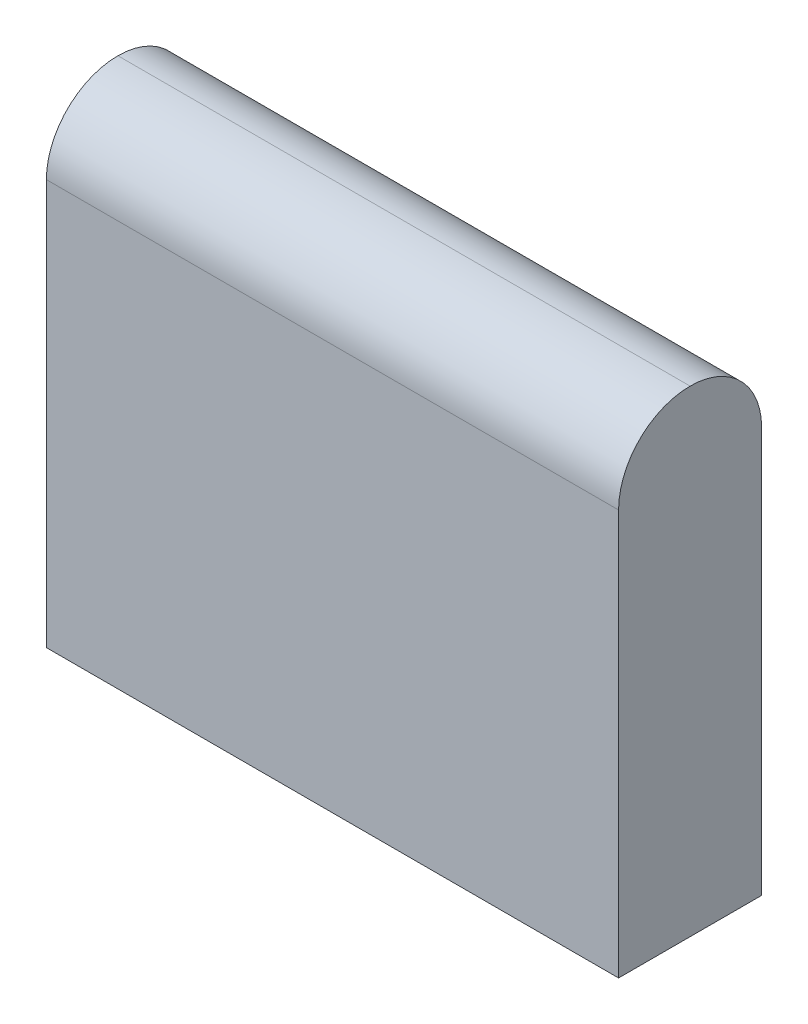
ISO-10303-21;
HEADER;
FILE_DESCRIPTION(('STEP AP214'),'2;1');
FILE_NAME('part.step','',(''),(''),'','','');
FILE_SCHEMA(('AUTOMOTIVE_DESIGN { 1 0 10303 214 1 1 1 1 }'));
ENDSEC;
DATA;
#1=APPLICATION_CONTEXT('core data for automotive mechanical design processes');
#2=APPLICATION_PROTOCOL_DEFINITION('international standard','automotive_design',2000,#1);
#3=PRODUCT_CONTEXT('',#1,'mechanical');
#4=PRODUCT('Part','Part','',(#3));
#5=PRODUCT_RELATED_PRODUCT_CATEGORY('part','',(#4));
#6=PRODUCT_DEFINITION_FORMATION('','',#4);
#7=PRODUCT_DEFINITION_CONTEXT('part definition',#1,'design');
#8=PRODUCT_DEFINITION('design','',#6,#7);
#9=PRODUCT_DEFINITION_SHAPE('','',#8);
#10=(LENGTH_UNIT() NAMED_UNIT(*) SI_UNIT(.MILLI.,.METRE.));
#11=(NAMED_UNIT(*) PLANE_ANGLE_UNIT() SI_UNIT($,.RADIAN.));
#12=(NAMED_UNIT(*) SI_UNIT($,.STERADIAN.) SOLID_ANGLE_UNIT());
#13=UNCERTAINTY_MEASURE_WITH_UNIT(LENGTH_MEASURE(1.E-05),#10,'distance_accuracy_value','');
#14=(GEOMETRIC_REPRESENTATION_CONTEXT(3) GLOBAL_UNCERTAINTY_ASSIGNED_CONTEXT((#13)) GLOBAL_UNIT_ASSIGNED_CONTEXT((#10,
#11,#12)) REPRESENTATION_CONTEXT('',''));
#15=CARTESIAN_POINT('',(0.,0.,0.));
#16=DIRECTION('',(0.,0.,1.));
#17=DIRECTION('',(1.,0.,0.));
#18=AXIS2_PLACEMENT_3D('',#15,#16,#17);
#19=CARTESIAN_POINT('',(19.05,-23.8125,-4.7625));
#20=DIRECTION('',(1.,0.,0.));
#21=DIRECTION('',(0.,0.,-1.));
#22=AXIS2_PLACEMENT_3D('',#19,#20,#21);
#23=PLANE('',#22);
#24=DIRECTION('',(0.,1.,0.));
#25=VECTOR('',#24,1.);
#26=CARTESIAN_POINT('',(19.05,-23.8125,-4.7625));
#27=LINE('',#26,#25);
#28=CARTESIAN_POINT('',(19.05,-23.8125,-4.7625));
#29=VERTEX_POINT('',#28);
#30=CARTESIAN_POINT('',(19.05,3.175,-4.7625));
#31=VERTEX_POINT('',#30);
#32=EDGE_CURVE('E157',#29,#31,#27,.T.);
#33=ORIENTED_EDGE('',*,*,#32,.T.);
#34=CARTESIAN_POINT('',(19.05,3.175,0.));
#35=DIRECTION('',(1.,0.,0.));
#36=DIRECTION('',(0.,0.,-1.));
#37=AXIS2_PLACEMENT_3D('',#34,#35,#36);
#38=CIRCLE('',#37,4.7625);
#39=CARTESIAN_POINT('',(19.05,7.9375,0.));
#40=VERTEX_POINT('',#39);
#41=EDGE_CURVE('E51',#31,#40,#38,.T.);
#42=ORIENTED_EDGE('',*,*,#41,.T.);
#43=CARTESIAN_POINT('',(19.05,3.175,0.));
#44=DIRECTION('',(1.,0.,0.));
#45=DIRECTION('',(0.,0.,-1.));
#46=AXIS2_PLACEMENT_3D('',#43,#44,#45);
#47=CIRCLE('',#46,4.7625);
#48=CARTESIAN_POINT('',(19.05,3.175,4.7625));
#49=VERTEX_POINT('',#48);
#50=EDGE_CURVE('E67',#40,#49,#47,.T.);
#51=ORIENTED_EDGE('',*,*,#50,.T.);
#52=DIRECTION('',(0.,1.,0.));
#53=VECTOR('',#52,1.);
#54=CARTESIAN_POINT('',(19.05,-23.8125,4.7625));
#55=LINE('',#54,#53);
#56=CARTESIAN_POINT('',(19.05,-23.8125,4.7625));
#57=VERTEX_POINT('',#56);
#58=EDGE_CURVE('E155',#57,#49,#55,.T.);
#59=ORIENTED_EDGE('',*,*,#58,.F.);
#60=DIRECTION('',(0.,0.,1.));
#61=VECTOR('',#60,1.);
#62=CARTESIAN_POINT('',(19.05,-23.8125,-4.7625));
#63=LINE('',#62,#61);
#64=EDGE_CURVE('E169',#29,#57,#63,.T.);
#65=ORIENTED_EDGE('',*,*,#64,.F.);
#66=EDGE_LOOP('',(#33,#42,#51,#59,#65));
#67=FACE_BOUND('',#66,.T.);
#68=ADVANCED_FACE('F45',(#67),#23,.T.);
#69=CARTESIAN_POINT('',(-19.05,-23.8125,-4.7625));
#70=DIRECTION('',(0.,-1.,0.));
#71=DIRECTION('',(0.,0.,-1.));
#72=AXIS2_PLACEMENT_3D('',#69,#70,#71);
#73=PLANE('',#72);
#74=ORIENTED_EDGE('',*,*,#64,.T.);
#75=DIRECTION('',(1.,0.,0.));
#76=VECTOR('',#75,1.);
#77=CARTESIAN_POINT('',(-19.05,-23.8125,4.7625));
#78=LINE('',#77,#76);
#79=CARTESIAN_POINT('',(-19.05,-23.8125,4.7625));
#80=VERTEX_POINT('',#79);
#81=EDGE_CURVE('E156',#80,#57,#78,.T.);
#82=ORIENTED_EDGE('',*,*,#81,.F.);
#83=DIRECTION('',(0.,0.,1.));
#84=VECTOR('',#83,1.);
#85=CARTESIAN_POINT('',(-19.05,-23.8125,-4.7625));
#86=LINE('',#85,#84);
#87=CARTESIAN_POINT('',(-19.05,-23.8125,-4.7625));
#88=VERTEX_POINT('',#87);
#89=EDGE_CURVE('E170',#88,#80,#86,.T.);
#90=ORIENTED_EDGE('',*,*,#89,.F.);
#91=DIRECTION('',(1.,0.,0.));
#92=VECTOR('',#91,1.);
#93=CARTESIAN_POINT('',(-19.05,-23.8125,-4.7625));
#94=LINE('',#93,#92);
#95=EDGE_CURVE('E163',#88,#29,#94,.T.);
#96=ORIENTED_EDGE('',*,*,#95,.T.);
#97=EDGE_LOOP('',(#74,#82,#90,#96));
#98=FACE_BOUND('',#97,.T.);
#99=ADVANCED_FACE('F200',(#98),#73,.T.);
#100=CARTESIAN_POINT('',(-19.05,-23.8125,-4.7625));
#101=DIRECTION('',(-1.,0.,0.));
#102=DIRECTION('',(0.,0.,1.));
#103=AXIS2_PLACEMENT_3D('',#100,#101,#102);
#104=PLANE('',#103);
#105=CARTESIAN_POINT('',(-19.05,3.175,0.));
#106=DIRECTION('',(-1.,0.,0.));
#107=DIRECTION('',(0.,0.,1.));
#108=AXIS2_PLACEMENT_3D('',#105,#106,#107);
#109=CIRCLE('',#108,3.70400000000001);
#110=CARTESIAN_POINT('',(-19.05,2.76812121212117,3.68158466587071));
#111=VERTEX_POINT('',#110);
#112=CARTESIAN_POINT('',(-19.05,4.29474947443616,-3.53069074183793));
#113=VERTEX_POINT('',#112);
#114=EDGE_CURVE('E59',#111,#113,#109,.T.);
#115=ORIENTED_EDGE('',*,*,#114,.F.);
#116=DIRECTION('',(0.,0.993948343917575,0.109848484848496));
#117=VECTOR('',#116,1.);
#118=CARTESIAN_POINT('',(-19.05,2.76812121212117,3.68158466587071));
#119=LINE('',#118,#117);
#120=CARTESIAN_POINT('',(-19.05,-10.2725984848485,2.24035956719007));
#121=VERTEX_POINT('',#120);
#122=EDGE_CURVE('E133',#121,#111,#119,.T.);
#123=ORIENTED_EDGE('',*,*,#122,.F.);
#124=CARTESIAN_POINT('',(-19.05,-10.025,-1.37910516340156E-13));
#125=DIRECTION('',(-1.,0.,0.));
#126=DIRECTION('',(0.,0.,1.));
#127=AXIS2_PLACEMENT_3D('',#124,#125,#126);
#128=CIRCLE('',#127,2.254);
#129=CARTESIAN_POINT('',(-19.05,-10.2725984848485,-2.24035956719035));
#130=VERTEX_POINT('',#129);
#131=EDGE_CURVE('E140',#130,#121,#128,.T.);
#132=ORIENTED_EDGE('',*,*,#131,.F.);
#133=DIRECTION('',(0.,-0.9960999966917,0.0882314943248434));
#134=VECTOR('',#133,1.);
#135=CARTESIAN_POINT('',(-19.05,4.29474947443616,-3.53069074183793));
#136=LINE('',#135,#134);
#137=EDGE_CURVE('E141',#113,#130,#136,.T.);
#138=ORIENTED_EDGE('',*,*,#137,.F.);
#139=EDGE_LOOP('',(#115,#123,#132,#138));
#140=FACE_BOUND('',#139,.T.);
#141=CARTESIAN_POINT('',(-19.05,3.175,0.));
#142=DIRECTION('',(-1.,0.,0.));
#143=DIRECTION('',(0.,0.,1.));
#144=AXIS2_PLACEMENT_3D('',#141,#142,#143);
#145=CIRCLE('',#144,4.7625);
#146=CARTESIAN_POINT('',(-19.05,3.175,4.7625));
#147=VERTEX_POINT('',#146);
#148=CARTESIAN_POINT('',(-19.05,7.9375,0.));
#149=VERTEX_POINT('',#148);
#150=EDGE_CURVE('E168',#147,#149,#145,.T.);
#151=ORIENTED_EDGE('',*,*,#150,.T.);
#152=CARTESIAN_POINT('',(-19.05,3.175,0.));
#153=DIRECTION('',(-1.,0.,0.));
#154=DIRECTION('',(0.,0.,1.));
#155=AXIS2_PLACEMENT_3D('',#152,#153,#154);
#156=CIRCLE('',#155,4.7625);
#157=CARTESIAN_POINT('',(-19.05,3.175,-4.7625));
#158=VERTEX_POINT('',#157);
#159=EDGE_CURVE('E173',#149,#158,#156,.T.);
#160=ORIENTED_EDGE('',*,*,#159,.T.);
#161=DIRECTION('',(0.,-1.,0.));
#162=VECTOR('',#161,1.);
#163=CARTESIAN_POINT('',(-19.05,-23.8125,-4.7625));
#164=LINE('',#163,#162);
#165=EDGE_CURVE('E165',#158,#88,#164,.T.);
#166=ORIENTED_EDGE('',*,*,#165,.T.);
#167=ORIENTED_EDGE('',*,*,#89,.T.);
#168=DIRECTION('',(0.,-1.,0.));
#169=VECTOR('',#168,1.);
#170=CARTESIAN_POINT('',(-19.05,-23.8125,4.7625));
#171=LINE('',#170,#169);
#172=EDGE_CURVE('E152',#147,#80,#171,.T.);
#173=ORIENTED_EDGE('',*,*,#172,.F.);
#174=EDGE_LOOP('',(#151,#160,#166,#167,#173));
#175=FACE_BOUND('',#174,.T.);
#176=ADVANCED_FACE('F195',(#140,#175),#104,.T.);
#177=CARTESIAN_POINT('',(0.,0.,-4.7625));
#178=DIRECTION('',(0.,0.,-1.));
#179=DIRECTION('',(-1.,0.,0.));
#180=AXIS2_PLACEMENT_3D('',#177,#178,#179);
#181=PLANE('',#180);
#182=ORIENTED_EDGE('',*,*,#165,.F.);
#183=DIRECTION('',(-1.,0.,0.));
#184=VECTOR('',#183,1.);
#185=CARTESIAN_POINT('',(0.,3.175,-4.7625));
#186=LINE('',#185,#184);
#187=EDGE_CURVE('E177',#158,#31,#186,.F.);
#188=ORIENTED_EDGE('',*,*,#187,.T.);
#189=ORIENTED_EDGE('',*,*,#32,.F.);
#190=ORIENTED_EDGE('',*,*,#95,.F.);
#191=EDGE_LOOP('',(#182,#188,#189,#190));
#192=FACE_BOUND('',#191,.T.);
#193=ADVANCED_FACE('F197',(#192),#181,.T.);
#194=CARTESIAN_POINT('',(0.,0.,4.7625));
#195=DIRECTION('',(0.,0.,-1.));
#196=DIRECTION('',(-1.,0.,0.));
#197=AXIS2_PLACEMENT_3D('',#194,#195,#196);
#198=PLANE('',#197);
#199=ORIENTED_EDGE('',*,*,#58,.T.);
#200=DIRECTION('',(-1.,0.,0.));
#201=VECTOR('',#200,1.);
#202=CARTESIAN_POINT('',(-19.05,3.175,4.7625));
#203=LINE('',#202,#201);
#204=EDGE_CURVE('E11',#49,#147,#203,.T.);
#205=ORIENTED_EDGE('',*,*,#204,.T.);
#206=ORIENTED_EDGE('',*,*,#172,.T.);
#207=ORIENTED_EDGE('',*,*,#81,.T.);
#208=EDGE_LOOP('',(#199,#205,#206,#207));
#209=FACE_BOUND('',#208,.T.);
#210=ADVANCED_FACE('F205',(#209),#198,.F.);
#211=CARTESIAN_POINT('',(0.,3.175,0.));
#212=DIRECTION('',(1.,0.,0.));
#213=DIRECTION('',(0.,0.,-1.));
#214=AXIS2_PLACEMENT_3D('',#211,#212,#213);
#215=CYLINDRICAL_SURFACE('',#214,4.7625);
#216=ORIENTED_EDGE('',*,*,#204,.F.);
#217=ORIENTED_EDGE('',*,*,#50,.F.);
#218=DIRECTION('',(-1.,0.,0.));
#219=VECTOR('',#218,1.);
#220=CARTESIAN_POINT('',(19.05,7.9375,0.));
#221=LINE('',#220,#219);
#222=EDGE_CURVE('E46',#149,#40,#221,.F.);
#223=ORIENTED_EDGE('',*,*,#222,.F.);
#224=ORIENTED_EDGE('',*,*,#150,.F.);
#225=EDGE_LOOP('',(#216,#217,#223,#224));
#226=FACE_BOUND('',#225,.T.);
#227=ADVANCED_FACE('F42',(#226),#215,.T.);
#228=CARTESIAN_POINT('',(-19.05,3.175,0.));
#229=DIRECTION('',(-1.,0.,0.));
#230=DIRECTION('',(0.,0.,1.));
#231=AXIS2_PLACEMENT_3D('',#228,#229,#230);
#232=CYLINDRICAL_SURFACE('',#231,4.7625);
#233=ORIENTED_EDGE('',*,*,#41,.F.);
#234=ORIENTED_EDGE('',*,*,#187,.F.);
#235=ORIENTED_EDGE('',*,*,#159,.F.);
#236=ORIENTED_EDGE('',*,*,#222,.T.);
#237=EDGE_LOOP('',(#233,#234,#235,#236));
#238=FACE_BOUND('',#237,.T.);
#239=ADVANCED_FACE('F188',(#238),#232,.T.);
#240=CARTESIAN_POINT('',(-15.24,3.175,0.));
#241=DIRECTION('',(-1.,0.,0.));
#242=DIRECTION('',(0.,0.,1.));
#243=AXIS2_PLACEMENT_3D('',#240,#241,#242);
#244=CYLINDRICAL_SURFACE('',#243,3.70400000000001);
#245=ORIENTED_EDGE('',*,*,#114,.T.);
#246=DIRECTION('',(-1.,0.,0.));
#247=VECTOR('',#246,1.);
#248=CARTESIAN_POINT('',(-15.24,4.29474947443616,-3.53069074183793));
#249=LINE('',#248,#247);
#250=CARTESIAN_POINT('',(-15.24,4.29474947443616,-3.53069074183793));
#251=VERTEX_POINT('',#250);
#252=EDGE_CURVE('E115',#251,#113,#249,.T.);
#253=ORIENTED_EDGE('',*,*,#252,.F.);
#254=CARTESIAN_POINT('',(-15.24,3.175,0.));
#255=DIRECTION('',(-1.,0.,0.));
#256=DIRECTION('',(0.,0.,1.));
#257=AXIS2_PLACEMENT_3D('',#254,#255,#256);
#258=CIRCLE('',#257,3.70400000000001);
#259=CARTESIAN_POINT('',(-15.24,2.76812121212117,3.68158466587071));
#260=VERTEX_POINT('',#259);
#261=EDGE_CURVE('E116',#260,#251,#258,.T.);
#262=ORIENTED_EDGE('',*,*,#261,.F.);
#263=DIRECTION('',(-1.,0.,0.));
#264=VECTOR('',#263,1.);
#265=CARTESIAN_POINT('',(-15.24,2.76812121212117,3.68158466587071));
#266=LINE('',#265,#264);
#267=EDGE_CURVE('E150',#260,#111,#266,.T.);
#268=ORIENTED_EDGE('',*,*,#267,.T.);
#269=EDGE_LOOP('',(#245,#253,#262,#268));
#270=FACE_BOUND('',#269,.T.);
#271=ADVANCED_FACE('F111',(#270),#244,.F.);
#272=CARTESIAN_POINT('',(-15.24,2.76812121212117,3.68158466587071));
#273=DIRECTION('',(0.,-0.109848484848496,0.993948343917575));
#274=DIRECTION('',(0.,-0.993948343917575,-0.109848484848496));
#275=AXIS2_PLACEMENT_3D('',#272,#273,#274);
#276=PLANE('',#275);
#277=ORIENTED_EDGE('',*,*,#122,.T.);
#278=ORIENTED_EDGE('',*,*,#267,.F.);
#279=DIRECTION('',(0.,0.993948343917575,0.109848484848496));
#280=VECTOR('',#279,1.);
#281=CARTESIAN_POINT('',(-15.24,2.76812121212117,3.68158466587071));
#282=LINE('',#281,#280);
#283=CARTESIAN_POINT('',(-15.24,-10.2725984848485,2.24035956719007));
#284=VERTEX_POINT('',#283);
#285=EDGE_CURVE('E125',#284,#260,#282,.T.);
#286=ORIENTED_EDGE('',*,*,#285,.F.);
#287=DIRECTION('',(-1.,0.,0.));
#288=VECTOR('',#287,1.);
#289=CARTESIAN_POINT('',(-15.24,-10.2725984848485,2.24035956719007));
#290=LINE('',#289,#288);
#291=EDGE_CURVE('E149',#284,#121,#290,.T.);
#292=ORIENTED_EDGE('',*,*,#291,.T.);
#293=EDGE_LOOP('',(#277,#278,#286,#292));
#294=FACE_BOUND('',#293,.T.);
#295=ADVANCED_FACE('F224',(#294),#276,.F.);
#296=CARTESIAN_POINT('',(-15.24,-10.025,-1.37910516340156E-13));
#297=DIRECTION('',(-1.,0.,0.));
#298=DIRECTION('',(0.,0.,1.));
#299=AXIS2_PLACEMENT_3D('',#296,#297,#298);
#300=CYLINDRICAL_SURFACE('',#299,2.254);
#301=ORIENTED_EDGE('',*,*,#131,.T.);
#302=ORIENTED_EDGE('',*,*,#291,.F.);
#303=CARTESIAN_POINT('',(-15.24,-10.025,-1.37910516340156E-13));
#304=DIRECTION('',(-1.,0.,0.));
#305=DIRECTION('',(0.,0.,1.));
#306=AXIS2_PLACEMENT_3D('',#303,#304,#305);
#307=CIRCLE('',#306,2.254);
#308=CARTESIAN_POINT('',(-15.24,-10.2725984848485,-2.24035956719035));
#309=VERTEX_POINT('',#308);
#310=EDGE_CURVE('E128',#309,#284,#307,.T.);
#311=ORIENTED_EDGE('',*,*,#310,.F.);
#312=DIRECTION('',(-1.,0.,0.));
#313=VECTOR('',#312,1.);
#314=CARTESIAN_POINT('',(-15.24,-10.2725984848485,-2.24035956719035));
#315=LINE('',#314,#313);
#316=EDGE_CURVE('E122',#309,#130,#315,.T.);
#317=ORIENTED_EDGE('',*,*,#316,.T.);
#318=EDGE_LOOP('',(#301,#302,#311,#317));
#319=FACE_BOUND('',#318,.T.);
#320=ADVANCED_FACE('F230',(#319),#300,.F.);
#321=CARTESIAN_POINT('',(-15.24,4.29474947443616,-3.53069074183793));
#322=DIRECTION('',(0.,-0.0882314943248434,-0.9960999966917));
#323=DIRECTION('',(0.,0.9960999966917,-0.0882314943248434));
#324=AXIS2_PLACEMENT_3D('',#321,#322,#323);
#325=PLANE('',#324);
#326=ORIENTED_EDGE('',*,*,#137,.T.);
#327=ORIENTED_EDGE('',*,*,#316,.F.);
#328=DIRECTION('',(0.,-0.9960999966917,0.0882314943248434));
#329=VECTOR('',#328,1.);
#330=CARTESIAN_POINT('',(-15.24,4.29474947443616,-3.53069074183793));
#331=LINE('',#330,#329);
#332=EDGE_CURVE('E121',#251,#309,#331,.T.);
#333=ORIENTED_EDGE('',*,*,#332,.F.);
#334=ORIENTED_EDGE('',*,*,#252,.T.);
#335=EDGE_LOOP('',(#326,#327,#333,#334));
#336=FACE_BOUND('',#335,.T.);
#337=ADVANCED_FACE('F127',(#336),#325,.F.);
#338=CARTESIAN_POINT('',(-15.24,3.175,0.));
#339=DIRECTION('',(-1.,0.,0.));
#340=DIRECTION('',(0.,0.,1.));
#341=AXIS2_PLACEMENT_3D('',#338,#339,#340);
#342=PLANE('',#341);
#343=ORIENTED_EDGE('',*,*,#261,.T.);
#344=ORIENTED_EDGE('',*,*,#332,.T.);
#345=ORIENTED_EDGE('',*,*,#310,.T.);
#346=ORIENTED_EDGE('',*,*,#285,.T.);
#347=EDGE_LOOP('',(#343,#344,#345,#346));
#348=FACE_BOUND('',#347,.T.);
#349=ADVANCED_FACE('F135',(#348),#342,.T.);
#350=CLOSED_SHELL('',(#68,#99,#176,#193,#210,#227,#239,#271,#295,#320,#337,#349));
#351=MANIFOLD_SOLID_BREP('B2',#350);
#352=ADVANCED_BREP_SHAPE_REPRESENTATION('',(#18,#351),#14);
#353=SHAPE_DEFINITION_REPRESENTATION(#9,#352);
ENDSEC;
END-ISO-10303-21;
